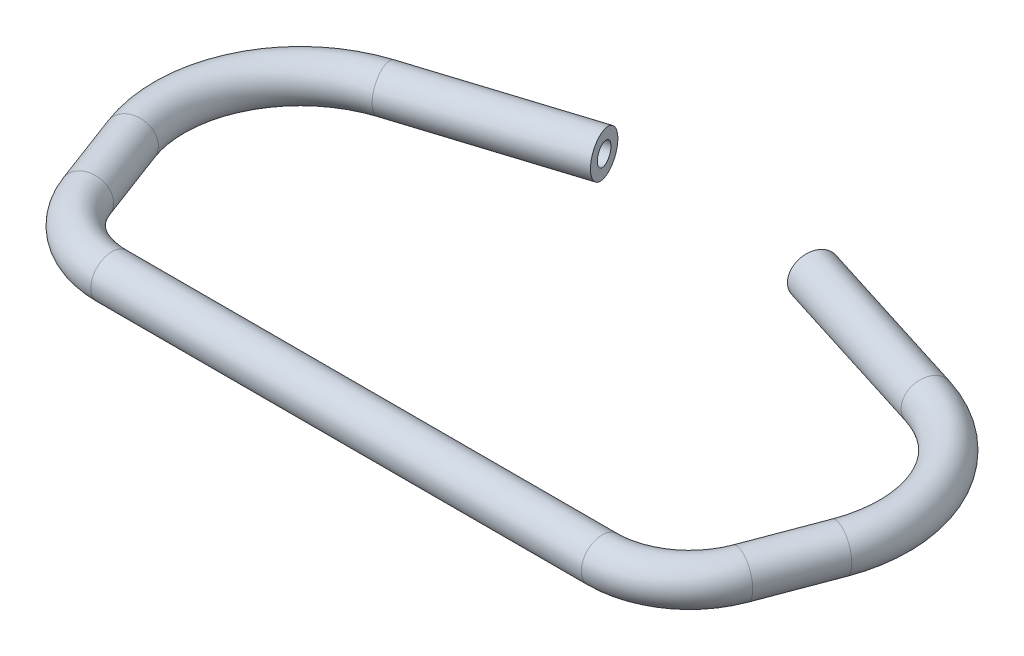
ISO-10303-21;
HEADER;
FILE_DESCRIPTION(('STEP AP214'),'2;1');
FILE_NAME('part.step','',(''),(''),'','','');
FILE_SCHEMA(('AUTOMOTIVE_DESIGN { 1 0 10303 214 1 1 1 1 }'));
ENDSEC;
DATA;
#1=APPLICATION_CONTEXT('core data for automotive mechanical design processes');
#2=APPLICATION_PROTOCOL_DEFINITION('international standard','automotive_design',2000,#1);
#3=PRODUCT_CONTEXT('',#1,'mechanical');
#4=PRODUCT('Part','Part','',(#3));
#5=PRODUCT_RELATED_PRODUCT_CATEGORY('part','',(#4));
#6=PRODUCT_DEFINITION_FORMATION('','',#4);
#7=PRODUCT_DEFINITION_CONTEXT('part definition',#1,'design');
#8=PRODUCT_DEFINITION('design','',#6,#7);
#9=PRODUCT_DEFINITION_SHAPE('','',#8);
#10=(LENGTH_UNIT() NAMED_UNIT(*) SI_UNIT(.MILLI.,.METRE.));
#11=(NAMED_UNIT(*) PLANE_ANGLE_UNIT() SI_UNIT($,.RADIAN.));
#12=(NAMED_UNIT(*) SI_UNIT($,.STERADIAN.) SOLID_ANGLE_UNIT());
#13=UNCERTAINTY_MEASURE_WITH_UNIT(LENGTH_MEASURE(1.E-05),#10,'distance_accuracy_value','');
#14=(GEOMETRIC_REPRESENTATION_CONTEXT(3) GLOBAL_UNCERTAINTY_ASSIGNED_CONTEXT((#13)) GLOBAL_UNIT_ASSIGNED_CONTEXT((#10,
#11,#12)) REPRESENTATION_CONTEXT('',''));
#15=CARTESIAN_POINT('',(0.,0.,0.));
#16=DIRECTION('',(0.,0.,1.));
#17=DIRECTION('',(1.,0.,0.));
#18=AXIS2_PLACEMENT_3D('',#15,#16,#17);
#19=CARTESIAN_POINT('',(-60.,0.,-201.498846579287));
#20=DIRECTION('',(-0.953716950748228,0.,0.30070579950427));
#21=DIRECTION('',(0.30070579950427,0.,0.953716950748228));
#22=AXIS2_PLACEMENT_3D('',#19,#20,#21);
#23=CYLINDRICAL_SURFACE('',#22,12.);
#24=CARTESIAN_POINT('',(-155.05293496282,0.,-171.528771306117));
#25=DIRECTION('',(-0.953716950748228,0.,0.30070579950427));
#26=DIRECTION('',(0.30070579950427,0.,0.953716950748228));
#27=AXIS2_PLACEMENT_3D('',#24,#25,#26);
#28=CIRCLE('',#27,12.);
#29=CARTESIAN_POINT('',(-158.661404556872,0.,-182.973374715096));
#30=VERTEX_POINT('',#29);
#31=EDGE_CURVE('E55',#30,#30,#28,.T.);
#32=ORIENTED_EDGE('',*,*,#31,.F.);
#33=EDGE_LOOP('',(#32));
#34=FACE_BOUND('',#33,.T.);
#35=CARTESIAN_POINT('',(-60.,0.,-201.498846579287));
#36=DIRECTION('',(-0.953716950748228,0.,0.30070579950427));
#37=DIRECTION('',(0.30070579950427,0.,0.953716950748228));
#38=AXIS2_PLACEMENT_3D('',#35,#36,#37);
#39=CIRCLE('',#38,12.);
#40=CARTESIAN_POINT('',(-56.3915304059488,0.,-190.054243170308));
#41=VERTEX_POINT('',#40);
#42=EDGE_CURVE('E52',#41,#41,#39,.T.);
#43=ORIENTED_EDGE('',*,*,#42,.T.);
#44=EDGE_LOOP('',(#43));
#45=FACE_BOUND('',#44,.T.);
#46=ADVANCED_FACE('F31',(#34,#45),#23,.T.);
#47=CARTESIAN_POINT('',(-132.5,0.,-99.9999999999999));
#48=DIRECTION('',(0.,1.,0.));
#49=DIRECTION('',(0.,0.,1.));
#50=AXIS2_PLACEMENT_3D('',#47,#48,#49);
#51=TOROIDAL_SURFACE('',#50,75.,12.);
#52=CARTESIAN_POINT('',(-202.693282774536,0.,-73.5821451791778));
#53=DIRECTION('',(0.352238064277629,0.,0.935910436993812));
#54=DIRECTION('',(0.935910436993812,0.,-0.352238064277629));
#55=AXIS2_PLACEMENT_3D('',#52,#53,#54);
#56=CIRCLE('',#55,12.);
#57=CARTESIAN_POINT('',(-213.924208018462,0.,-69.3552884078462));
#58=VERTEX_POINT('',#57);
#59=EDGE_CURVE('E58',#58,#58,#56,.T.);
#60=CARTESIAN_POINT('',(-132.5,0.,-99.9999999999999));
#61=DIRECTION('',(0.,1.,0.));
#62=DIRECTION('',(0.,0.,1.));
#63=AXIS2_PLACEMENT_3D('',#60,#61,#62);
#64=CIRCLE('',#63,87.);
#65=EDGE_CURVE('',#30,#58,#64,.T.);
#66=ORIENTED_EDGE('',*,*,#31,.T.);
#67=ORIENTED_EDGE('',*,*,#59,.F.);
#68=ORIENTED_EDGE('',*,*,#65,.T.);
#69=ORIENTED_EDGE('',*,*,#65,.F.);
#70=EDGE_LOOP('',(#66,#68,#67,#69));
#71=FACE_BOUND('',#70,.T.);
#72=ADVANCED_FACE('F115',(#71),#51,.T.);
#73=CARTESIAN_POINT('',(-202.693282774536,0.,-73.5821451791778));
#74=DIRECTION('',(0.352238064277629,0.,0.935910436993812));
#75=DIRECTION('',(0.935910436993812,0.,-0.352238064277629));
#76=AXIS2_PLACEMENT_3D('',#73,#74,#75);
#77=CYLINDRICAL_SURFACE('',#76,12.);
#78=CARTESIAN_POINT('',(-187.18954300181,0.,-32.3880967861185));
#79=DIRECTION('',(0.352238064277629,0.,0.935910436993812));
#80=DIRECTION('',(0.935910436993812,0.,-0.352238064277629));
#81=AXIS2_PLACEMENT_3D('',#78,#79,#80);
#82=CIRCLE('',#81,12.);
#83=CARTESIAN_POINT('',(-198.420468245736,0.,-28.161240014787));
#84=VERTEX_POINT('',#83);
#85=EDGE_CURVE('E61',#84,#84,#82,.T.);
#86=ORIENTED_EDGE('',*,*,#85,.F.);
#87=EDGE_LOOP('',(#86));
#88=FACE_BOUND('',#87,.T.);
#89=ORIENTED_EDGE('',*,*,#59,.T.);
#90=EDGE_LOOP('',(#89));
#91=FACE_BOUND('',#90,.T.);
#92=ADVANCED_FACE('F119',(#88,#91),#77,.T.);
#93=CARTESIAN_POINT('',(-140.394021152119,0.,-50.));
#94=DIRECTION('',(0.,1.,0.));
#95=DIRECTION('',(0.,0.,1.));
#96=AXIS2_PLACEMENT_3D('',#93,#94,#95);
#97=TOROIDAL_SURFACE('',#96,50.,12.);
#98=CARTESIAN_POINT('',(-140.394021152119,0.,0.));
#99=DIRECTION('',(1.,0.,0.));
#100=DIRECTION('',(0.,0.,-1.));
#101=AXIS2_PLACEMENT_3D('',#98,#99,#100);
#102=CIRCLE('',#101,12.);
#103=CARTESIAN_POINT('',(-140.394021152119,0.,12.));
#104=VERTEX_POINT('',#103);
#105=EDGE_CURVE('E64',#104,#104,#102,.T.);
#106=CARTESIAN_POINT('',(-140.394021152119,0.,-50.));
#107=DIRECTION('',(0.,1.,0.));
#108=DIRECTION('',(0.,0.,1.));
#109=AXIS2_PLACEMENT_3D('',#106,#107,#108);
#110=CIRCLE('',#109,62.);
#111=EDGE_CURVE('',#84,#104,#110,.T.);
#112=ORIENTED_EDGE('',*,*,#85,.T.);
#113=ORIENTED_EDGE('',*,*,#105,.F.);
#114=ORIENTED_EDGE('',*,*,#111,.T.);
#115=ORIENTED_EDGE('',*,*,#111,.F.);
#116=EDGE_LOOP('',(#112,#114,#113,#115));
#117=FACE_BOUND('',#116,.T.);
#118=ADVANCED_FACE('F123',(#117),#97,.T.);
#119=CARTESIAN_POINT('',(-140.394021152119,0.,0.));
#120=DIRECTION('',(1.,0.,0.));
#121=DIRECTION('',(0.,0.,-1.));
#122=AXIS2_PLACEMENT_3D('',#119,#120,#121);
#123=CYLINDRICAL_SURFACE('',#122,12.);
#124=CARTESIAN_POINT('',(140.394021152119,0.,0.));
#125=DIRECTION('',(1.,0.,0.));
#126=DIRECTION('',(0.,0.,-1.));
#127=AXIS2_PLACEMENT_3D('',#124,#125,#126);
#128=CIRCLE('',#127,12.);
#129=CARTESIAN_POINT('',(140.394021152119,0.,12.));
#130=VERTEX_POINT('',#129);
#131=EDGE_CURVE('E67',#130,#130,#128,.T.);
#132=ORIENTED_EDGE('',*,*,#131,.F.);
#133=EDGE_LOOP('',(#132));
#134=FACE_BOUND('',#133,.T.);
#135=ORIENTED_EDGE('',*,*,#105,.T.);
#136=EDGE_LOOP('',(#135));
#137=FACE_BOUND('',#136,.T.);
#138=ADVANCED_FACE('F127',(#134,#137),#123,.T.);
#139=CARTESIAN_POINT('',(140.394021152119,0.,-50.));
#140=DIRECTION('',(0.,1.,0.));
#141=DIRECTION('',(0.,0.,1.));
#142=AXIS2_PLACEMENT_3D('',#139,#140,#141);
#143=TOROIDAL_SURFACE('',#142,50.,12.);
#144=CARTESIAN_POINT('',(187.18954300181,0.,-32.3880967861185));
#145=DIRECTION('',(0.35223806427763,0.,-0.935910436993812));
#146=DIRECTION('',(-0.935910436993812,0.,-0.35223806427763));
#147=AXIS2_PLACEMENT_3D('',#144,#145,#146);
#148=CIRCLE('',#147,12.);
#149=CARTESIAN_POINT('',(198.420468245736,0.,-28.1612400147869));
#150=VERTEX_POINT('',#149);
#151=EDGE_CURVE('E70',#150,#150,#148,.T.);
#152=CARTESIAN_POINT('',(140.394021152119,0.,-50.));
#153=DIRECTION('',(0.,1.,0.));
#154=DIRECTION('',(0.,0.,1.));
#155=AXIS2_PLACEMENT_3D('',#152,#153,#154);
#156=CIRCLE('',#155,62.);
#157=EDGE_CURVE('',#130,#150,#156,.T.);
#158=ORIENTED_EDGE('',*,*,#131,.T.);
#159=ORIENTED_EDGE('',*,*,#151,.F.);
#160=ORIENTED_EDGE('',*,*,#157,.T.);
#161=ORIENTED_EDGE('',*,*,#157,.F.);
#162=EDGE_LOOP('',(#158,#160,#159,#161));
#163=FACE_BOUND('',#162,.T.);
#164=ADVANCED_FACE('F89',(#163),#143,.T.);
#165=CARTESIAN_POINT('',(187.18954300181,0.,-32.3880967861185));
#166=DIRECTION('',(0.35223806427763,0.,-0.935910436993812));
#167=DIRECTION('',(-0.935910436993812,0.,-0.35223806427763));
#168=AXIS2_PLACEMENT_3D('',#165,#166,#167);
#169=CYLINDRICAL_SURFACE('',#168,12.);
#170=CARTESIAN_POINT('',(202.693282774536,0.,-73.5821451791777));
#171=DIRECTION('',(0.35223806427763,0.,-0.935910436993812));
#172=DIRECTION('',(-0.935910436993812,0.,-0.35223806427763));
#173=AXIS2_PLACEMENT_3D('',#170,#171,#172);
#174=CIRCLE('',#173,12.);
#175=CARTESIAN_POINT('',(213.924208018462,0.,-69.3552884078462));
#176=VERTEX_POINT('',#175);
#177=EDGE_CURVE('E72',#176,#176,#174,.T.);
#178=ORIENTED_EDGE('',*,*,#177,.F.);
#179=EDGE_LOOP('',(#178));
#180=FACE_BOUND('',#179,.T.);
#181=ORIENTED_EDGE('',*,*,#151,.T.);
#182=EDGE_LOOP('',(#181));
#183=FACE_BOUND('',#182,.T.);
#184=ADVANCED_FACE('F82',(#180,#183),#169,.T.);
#185=CARTESIAN_POINT('',(132.5,0.,-99.9999999999999));
#186=DIRECTION('',(0.,1.,0.));
#187=DIRECTION('',(0.,0.,1.));
#188=AXIS2_PLACEMENT_3D('',#185,#186,#187);
#189=TOROIDAL_SURFACE('',#188,75.,12.);
#190=CARTESIAN_POINT('',(155.05293496282,0.,-171.528771306117));
#191=DIRECTION('',(-0.953716950748228,0.,-0.300705799504271));
#192=DIRECTION('',(-0.300705799504271,0.,0.953716950748228));
#193=AXIS2_PLACEMENT_3D('',#190,#191,#192);
#194=CIRCLE('',#193,12.);
#195=CARTESIAN_POINT('',(158.661404556872,0.,-182.973374715096));
#196=VERTEX_POINT('',#195);
#197=EDGE_CURVE('E35',#196,#196,#194,.T.);
#198=CARTESIAN_POINT('',(132.5,0.,-99.9999999999999));
#199=DIRECTION('',(0.,1.,0.));
#200=DIRECTION('',(0.,0.,1.));
#201=AXIS2_PLACEMENT_3D('',#198,#199,#200);
#202=CIRCLE('',#201,87.);
#203=EDGE_CURVE('',#176,#196,#202,.T.);
#204=ORIENTED_EDGE('',*,*,#177,.T.);
#205=ORIENTED_EDGE('',*,*,#197,.F.);
#206=ORIENTED_EDGE('',*,*,#203,.T.);
#207=ORIENTED_EDGE('',*,*,#203,.F.);
#208=EDGE_LOOP('',(#204,#206,#205,#207));
#209=FACE_BOUND('',#208,.T.);
#210=ADVANCED_FACE('F80',(#209),#189,.T.);
#211=CARTESIAN_POINT('',(155.05293496282,0.,-171.528771306117));
#212=DIRECTION('',(-0.953716950748228,0.,-0.30070579950427));
#213=DIRECTION('',(-0.30070579950427,0.,0.953716950748228));
#214=AXIS2_PLACEMENT_3D('',#211,#212,#213);
#215=CYLINDRICAL_SURFACE('',#214,12.);
#216=CARTESIAN_POINT('',(60.,0.,-201.498846579287));
#217=DIRECTION('',(-0.953716950748228,0.,-0.30070579950427));
#218=DIRECTION('',(-0.30070579950427,0.,0.953716950748228));
#219=AXIS2_PLACEMENT_3D('',#216,#217,#218);
#220=CIRCLE('',#219,12.);
#221=CARTESIAN_POINT('',(56.3915304059488,0.,-190.054243170308));
#222=VERTEX_POINT('',#221);
#223=EDGE_CURVE('E48',#222,#222,#220,.T.);
#224=ORIENTED_EDGE('',*,*,#223,.F.);
#225=EDGE_LOOP('',(#224));
#226=FACE_BOUND('',#225,.T.);
#227=ORIENTED_EDGE('',*,*,#197,.T.);
#228=EDGE_LOOP('',(#227));
#229=FACE_BOUND('',#228,.T.);
#230=ADVANCED_FACE('F33',(#226,#229),#215,.T.);
#231=CARTESIAN_POINT('',(-60.,0.,-201.498846579287));
#232=DIRECTION('',(-0.953716950748228,0.,0.30070579950427));
#233=DIRECTION('',(0.30070579950427,0.,0.953716950748228));
#234=AXIS2_PLACEMENT_3D('',#231,#232,#233);
#235=PLANE('',#234);
#236=CARTESIAN_POINT('',(-60.,0.,-201.498846579287));
#237=DIRECTION('',(-0.953716950748228,0.,0.30070579950427));
#238=DIRECTION('',(0.30070579950427,0.,0.953716950748228));
#239=AXIS2_PLACEMENT_3D('',#236,#237,#238);
#240=CIRCLE('',#239,6.);
#241=CARTESIAN_POINT('',(-58.1957652029744,0.,-195.776544874797));
#242=VERTEX_POINT('',#241);
#243=EDGE_CURVE('E51',#242,#242,#240,.F.);
#244=ORIENTED_EDGE('',*,*,#243,.F.);
#245=EDGE_LOOP('',(#244));
#246=FACE_BOUND('',#245,.T.);
#247=ORIENTED_EDGE('',*,*,#42,.F.);
#248=EDGE_LOOP('',(#247));
#249=FACE_BOUND('',#248,.T.);
#250=ADVANCED_FACE('F87',(#246,#249),#235,.F.);
#251=CARTESIAN_POINT('',(60.,0.,-201.498846579287));
#252=DIRECTION('',(-0.953716950748228,0.,-0.30070579950427));
#253=DIRECTION('',(-0.30070579950427,0.,0.953716950748228));
#254=AXIS2_PLACEMENT_3D('',#251,#252,#253);
#255=PLANE('',#254);
#256=CARTESIAN_POINT('',(60.,0.,-201.498846579287));
#257=DIRECTION('',(-0.953716950748228,0.,-0.30070579950427));
#258=DIRECTION('',(-0.30070579950427,0.,0.953716950748228));
#259=AXIS2_PLACEMENT_3D('',#256,#257,#258);
#260=CIRCLE('',#259,6.);
#261=CARTESIAN_POINT('',(58.1957652029744,0.,-195.776544874797));
#262=VERTEX_POINT('',#261);
#263=EDGE_CURVE('E10',#262,#262,#260,.F.);
#264=ORIENTED_EDGE('',*,*,#263,.T.);
#265=EDGE_LOOP('',(#264));
#266=FACE_BOUND('',#265,.T.);
#267=ORIENTED_EDGE('',*,*,#223,.T.);
#268=EDGE_LOOP('',(#267));
#269=FACE_BOUND('',#268,.T.);
#270=ADVANCED_FACE('F106',(#266,#269),#255,.T.);
#271=CARTESIAN_POINT('',(-60.,0.,-201.498846579287));
#272=DIRECTION('',(-0.953716950748228,0.,0.30070579950427));
#273=DIRECTION('',(0.30070579950427,0.,0.953716950748228));
#274=AXIS2_PLACEMENT_3D('',#271,#272,#273);
#275=CYLINDRICAL_SURFACE('',#274,6.);
#276=CARTESIAN_POINT('',(-155.05293496282,0.,-171.528771306117));
#277=DIRECTION('',(-0.953716950748228,0.,0.30070579950427));
#278=DIRECTION('',(0.30070579950427,0.,0.953716950748228));
#279=AXIS2_PLACEMENT_3D('',#276,#277,#278);
#280=CIRCLE('',#279,6.);
#281=CARTESIAN_POINT('',(-156.857169759846,0.,-177.251073010606));
#282=VERTEX_POINT('',#281);
#283=EDGE_CURVE('E280',#282,#282,#280,.F.);
#284=ORIENTED_EDGE('',*,*,#283,.F.);
#285=EDGE_LOOP('',(#284));
#286=FACE_BOUND('',#285,.T.);
#287=ORIENTED_EDGE('',*,*,#243,.T.);
#288=EDGE_LOOP('',(#287));
#289=FACE_BOUND('',#288,.T.);
#290=ADVANCED_FACE('F109',(#286,#289),#275,.F.);
#291=CARTESIAN_POINT('',(-132.5,0.,-99.9999999999999));
#292=DIRECTION('',(0.,1.,0.));
#293=DIRECTION('',(0.,0.,1.));
#294=AXIS2_PLACEMENT_3D('',#291,#292,#293);
#295=TOROIDAL_SURFACE('',#294,75.,6.);
#296=CARTESIAN_POINT('',(-202.693282774536,0.,-73.5821451791778));
#297=DIRECTION('',(0.352238064277629,0.,0.935910436993812));
#298=DIRECTION('',(0.935910436993812,0.,-0.352238064277629));
#299=AXIS2_PLACEMENT_3D('',#296,#297,#298);
#300=CIRCLE('',#299,6.);
#301=CARTESIAN_POINT('',(-208.308745396499,0.,-71.468716793512));
#302=VERTEX_POINT('',#301);
#303=EDGE_CURVE('E277',#302,#302,#300,.F.);
#304=CARTESIAN_POINT('',(-132.5,0.,-99.9999999999999));
#305=DIRECTION('',(0.,1.,0.));
#306=DIRECTION('',(0.,0.,1.));
#307=AXIS2_PLACEMENT_3D('',#304,#305,#306);
#308=CIRCLE('',#307,81.);
#309=EDGE_CURVE('',#282,#302,#308,.T.);
#310=ORIENTED_EDGE('',*,*,#283,.T.);
#311=ORIENTED_EDGE('',*,*,#303,.F.);
#312=ORIENTED_EDGE('',*,*,#309,.T.);
#313=ORIENTED_EDGE('',*,*,#309,.F.);
#314=EDGE_LOOP('',(#310,#312,#311,#313));
#315=FACE_BOUND('',#314,.T.);
#316=ADVANCED_FACE('F188',(#315),#295,.F.);
#317=CARTESIAN_POINT('',(-202.693282774536,0.,-73.5821451791778));
#318=DIRECTION('',(0.352238064277629,0.,0.935910436993812));
#319=DIRECTION('',(0.935910436993812,0.,-0.352238064277629));
#320=AXIS2_PLACEMENT_3D('',#317,#318,#319);
#321=CYLINDRICAL_SURFACE('',#320,6.);
#322=CARTESIAN_POINT('',(-187.18954300181,0.,-32.3880967861185));
#323=DIRECTION('',(0.352238064277629,0.,0.935910436993812));
#324=DIRECTION('',(0.935910436993812,0.,-0.352238064277629));
#325=AXIS2_PLACEMENT_3D('',#322,#323,#324);
#326=CIRCLE('',#325,6.);
#327=CARTESIAN_POINT('',(-192.805005623773,0.,-30.2746684004528));
#328=VERTEX_POINT('',#327);
#329=EDGE_CURVE('E274',#328,#328,#326,.F.);
#330=ORIENTED_EDGE('',*,*,#329,.F.);
#331=EDGE_LOOP('',(#330));
#332=FACE_BOUND('',#331,.T.);
#333=ORIENTED_EDGE('',*,*,#303,.T.);
#334=EDGE_LOOP('',(#333));
#335=FACE_BOUND('',#334,.T.);
#336=ADVANCED_FACE('F198',(#332,#335),#321,.F.);
#337=CARTESIAN_POINT('',(-140.394021152119,0.,-50.));
#338=DIRECTION('',(0.,1.,0.));
#339=DIRECTION('',(0.,0.,1.));
#340=AXIS2_PLACEMENT_3D('',#337,#338,#339);
#341=TOROIDAL_SURFACE('',#340,50.,6.);
#342=CARTESIAN_POINT('',(-140.394021152119,0.,0.));
#343=DIRECTION('',(1.,0.,0.));
#344=DIRECTION('',(0.,0.,-1.));
#345=AXIS2_PLACEMENT_3D('',#342,#343,#344);
#346=CIRCLE('',#345,6.);
#347=CARTESIAN_POINT('',(-140.394021152119,0.,6.00000000000003));
#348=VERTEX_POINT('',#347);
#349=EDGE_CURVE('E269',#348,#348,#346,.F.);
#350=CARTESIAN_POINT('',(-140.394021152119,0.,-50.));
#351=DIRECTION('',(0.,1.,0.));
#352=DIRECTION('',(0.,0.,1.));
#353=AXIS2_PLACEMENT_3D('',#350,#351,#352);
#354=CIRCLE('',#353,56.);
#355=EDGE_CURVE('',#328,#348,#354,.T.);
#356=ORIENTED_EDGE('',*,*,#329,.T.);
#357=ORIENTED_EDGE('',*,*,#349,.F.);
#358=ORIENTED_EDGE('',*,*,#355,.T.);
#359=ORIENTED_EDGE('',*,*,#355,.F.);
#360=EDGE_LOOP('',(#356,#358,#357,#359));
#361=FACE_BOUND('',#360,.T.);
#362=ADVANCED_FACE('F208',(#361),#341,.F.);
#363=CARTESIAN_POINT('',(-140.394021152119,0.,0.));
#364=DIRECTION('',(1.,0.,0.));
#365=DIRECTION('',(0.,0.,-1.));
#366=AXIS2_PLACEMENT_3D('',#363,#364,#365);
#367=CYLINDRICAL_SURFACE('',#366,6.);
#368=CARTESIAN_POINT('',(140.394021152119,0.,0.));
#369=DIRECTION('',(1.,0.,0.));
#370=DIRECTION('',(0.,0.,-1.));
#371=AXIS2_PLACEMENT_3D('',#368,#369,#370);
#372=CIRCLE('',#371,6.);
#373=CARTESIAN_POINT('',(140.394021152119,0.,6.00000000000001));
#374=VERTEX_POINT('',#373);
#375=EDGE_CURVE('E266',#374,#374,#372,.F.);
#376=ORIENTED_EDGE('',*,*,#375,.F.);
#377=EDGE_LOOP('',(#376));
#378=FACE_BOUND('',#377,.T.);
#379=ORIENTED_EDGE('',*,*,#349,.T.);
#380=EDGE_LOOP('',(#379));
#381=FACE_BOUND('',#380,.T.);
#382=ADVANCED_FACE('F218',(#378,#381),#367,.F.);
#383=CARTESIAN_POINT('',(140.394021152119,0.,-50.));
#384=DIRECTION('',(0.,1.,0.));
#385=DIRECTION('',(0.,0.,1.));
#386=AXIS2_PLACEMENT_3D('',#383,#384,#385);
#387=TOROIDAL_SURFACE('',#386,50.,6.);
#388=CARTESIAN_POINT('',(187.18954300181,0.,-32.3880967861185));
#389=DIRECTION('',(0.35223806427763,0.,-0.935910436993812));
#390=DIRECTION('',(-0.935910436993812,0.,-0.35223806427763));
#391=AXIS2_PLACEMENT_3D('',#388,#389,#390);
#392=CIRCLE('',#391,6.);
#393=CARTESIAN_POINT('',(192.805005623773,0.,-30.2746684004527));
#394=VERTEX_POINT('',#393);
#395=EDGE_CURVE('E265',#394,#394,#392,.F.);
#396=CARTESIAN_POINT('',(140.394021152119,0.,-50.));
#397=DIRECTION('',(0.,1.,0.));
#398=DIRECTION('',(0.,0.,1.));
#399=AXIS2_PLACEMENT_3D('',#396,#397,#398);
#400=CIRCLE('',#399,56.);
#401=EDGE_CURVE('',#374,#394,#400,.T.);
#402=ORIENTED_EDGE('',*,*,#375,.T.);
#403=ORIENTED_EDGE('',*,*,#395,.F.);
#404=ORIENTED_EDGE('',*,*,#401,.T.);
#405=ORIENTED_EDGE('',*,*,#401,.F.);
#406=EDGE_LOOP('',(#402,#404,#403,#405));
#407=FACE_BOUND('',#406,.T.);
#408=ADVANCED_FACE('F228',(#407),#387,.F.);
#409=CARTESIAN_POINT('',(187.18954300181,0.,-32.3880967861185));
#410=DIRECTION('',(0.35223806427763,0.,-0.935910436993812));
#411=DIRECTION('',(-0.935910436993812,0.,-0.35223806427763));
#412=AXIS2_PLACEMENT_3D('',#409,#410,#411);
#413=CYLINDRICAL_SURFACE('',#412,6.);
#414=CARTESIAN_POINT('',(202.693282774536,0.,-73.5821451791777));
#415=DIRECTION('',(0.35223806427763,0.,-0.935910436993812));
#416=DIRECTION('',(-0.935910436993812,0.,-0.35223806427763));
#417=AXIS2_PLACEMENT_3D('',#414,#415,#416);
#418=CIRCLE('',#417,6.);
#419=CARTESIAN_POINT('',(208.308745396499,0.,-71.4687167935119));
#420=VERTEX_POINT('',#419);
#421=EDGE_CURVE('E44',#420,#420,#418,.F.);
#422=ORIENTED_EDGE('',*,*,#421,.F.);
#423=EDGE_LOOP('',(#422));
#424=FACE_BOUND('',#423,.T.);
#425=ORIENTED_EDGE('',*,*,#395,.T.);
#426=EDGE_LOOP('',(#425));
#427=FACE_BOUND('',#426,.T.);
#428=ADVANCED_FACE('F100',(#424,#427),#413,.F.);
#429=CARTESIAN_POINT('',(132.5,0.,-99.9999999999999));
#430=DIRECTION('',(0.,1.,0.));
#431=DIRECTION('',(0.,0.,1.));
#432=AXIS2_PLACEMENT_3D('',#429,#430,#431);
#433=TOROIDAL_SURFACE('',#432,75.,6.);
#434=CARTESIAN_POINT('',(155.05293496282,0.,-171.528771306117));
#435=DIRECTION('',(-0.953716950748228,0.,-0.300705799504271));
#436=DIRECTION('',(-0.300705799504271,0.,0.953716950748228));
#437=AXIS2_PLACEMENT_3D('',#434,#435,#436);
#438=CIRCLE('',#437,6.);
#439=CARTESIAN_POINT('',(156.857169759846,0.,-177.251073010606));
#440=VERTEX_POINT('',#439);
#441=EDGE_CURVE('E39',#440,#440,#438,.F.);
#442=CARTESIAN_POINT('',(132.5,0.,-99.9999999999999));
#443=DIRECTION('',(0.,1.,0.));
#444=DIRECTION('',(0.,0.,1.));
#445=AXIS2_PLACEMENT_3D('',#442,#443,#444);
#446=CIRCLE('',#445,81.);
#447=EDGE_CURVE('',#420,#440,#446,.T.);
#448=ORIENTED_EDGE('',*,*,#421,.T.);
#449=ORIENTED_EDGE('',*,*,#441,.F.);
#450=ORIENTED_EDGE('',*,*,#447,.T.);
#451=ORIENTED_EDGE('',*,*,#447,.F.);
#452=EDGE_LOOP('',(#448,#450,#449,#451));
#453=FACE_BOUND('',#452,.T.);
#454=ADVANCED_FACE('F94',(#453),#433,.F.);
#455=CARTESIAN_POINT('',(155.05293496282,0.,-171.528771306117));
#456=DIRECTION('',(-0.953716950748228,0.,-0.30070579950427));
#457=DIRECTION('',(-0.30070579950427,0.,0.953716950748228));
#458=AXIS2_PLACEMENT_3D('',#455,#456,#457);
#459=CYLINDRICAL_SURFACE('',#458,6.);
#460=ORIENTED_EDGE('',*,*,#263,.F.);
#461=EDGE_LOOP('',(#460));
#462=FACE_BOUND('',#461,.T.);
#463=ORIENTED_EDGE('',*,*,#441,.T.);
#464=EDGE_LOOP('',(#463));
#465=FACE_BOUND('',#464,.T.);
#466=ADVANCED_FACE('F92',(#462,#465),#459,.F.);
#467=CLOSED_SHELL('',(#46,#72,#92,#118,#138,#164,#184,#210,#230,#250,#270,#290,#316,#336,#362,
#382,#408,#428,#454,#466));
#468=MANIFOLD_SOLID_BREP('B2',#467);
#469=ADVANCED_BREP_SHAPE_REPRESENTATION('',(#18,#468),#14);
#470=SHAPE_DEFINITION_REPRESENTATION(#9,#469);
ENDSEC;
END-ISO-10303-21;
